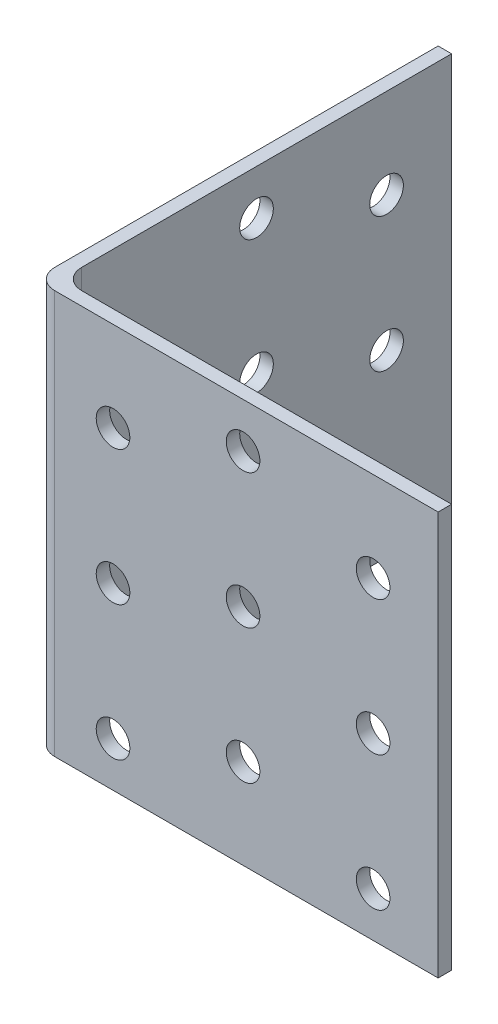
ISO-10303-21;
HEADER;
FILE_DESCRIPTION(('STEP AP214'),'2;1');
FILE_NAME('part.step','',(''),(''),'','','');
FILE_SCHEMA(('AUTOMOTIVE_DESIGN { 1 0 10303 214 1 1 1 1 }'));
ENDSEC;
DATA;
#1=APPLICATION_CONTEXT('core data for automotive mechanical design processes');
#2=APPLICATION_PROTOCOL_DEFINITION('international standard','automotive_design',2000,#1);
#3=PRODUCT_CONTEXT('',#1,'mechanical');
#4=PRODUCT('Part','Part','',(#3));
#5=PRODUCT_RELATED_PRODUCT_CATEGORY('part','',(#4));
#6=PRODUCT_DEFINITION_FORMATION('','',#4);
#7=PRODUCT_DEFINITION_CONTEXT('part definition',#1,'design');
#8=PRODUCT_DEFINITION('design','',#6,#7);
#9=PRODUCT_DEFINITION_SHAPE('','',#8);
#10=(LENGTH_UNIT() NAMED_UNIT(*) SI_UNIT(.MILLI.,.METRE.));
#11=(NAMED_UNIT(*) PLANE_ANGLE_UNIT() SI_UNIT($,.RADIAN.));
#12=(NAMED_UNIT(*) SI_UNIT($,.STERADIAN.) SOLID_ANGLE_UNIT());
#13=UNCERTAINTY_MEASURE_WITH_UNIT(LENGTH_MEASURE(1.E-05),#10,'distance_accuracy_value','');
#14=(GEOMETRIC_REPRESENTATION_CONTEXT(3) GLOBAL_UNCERTAINTY_ASSIGNED_CONTEXT((#13)) GLOBAL_UNIT_ASSIGNED_CONTEXT((#10,
#11,#12)) REPRESENTATION_CONTEXT('',''));
#15=CARTESIAN_POINT('',(0.,0.,0.));
#16=DIRECTION('',(0.,0.,1.));
#17=DIRECTION('',(1.,0.,0.));
#18=AXIS2_PLACEMENT_3D('',#15,#16,#17);
#19=CARTESIAN_POINT('',(0.,30.,-60.));
#20=DIRECTION('',(0.,0.,1.));
#21=DIRECTION('',(1.,0.,0.));
#22=AXIS2_PLACEMENT_3D('',#19,#20,#21);
#23=PLANE('',#22);
#24=DIRECTION('',(-1.,0.,0.));
#25=VECTOR('',#24,1.);
#26=CARTESIAN_POINT('',(0.,-30.,-60.));
#27=LINE('',#26,#25);
#28=CARTESIAN_POINT('',(2.,-30.,-60.));
#29=VERTEX_POINT('',#28);
#30=CARTESIAN_POINT('',(0.,-30.,-60.));
#31=VERTEX_POINT('',#30);
#32=EDGE_CURVE('E134',#29,#31,#27,.T.);
#33=ORIENTED_EDGE('',*,*,#32,.T.);
#34=DIRECTION('',(0.,-1.,0.));
#35=VECTOR('',#34,1.);
#36=CARTESIAN_POINT('',(0.,30.,-60.));
#37=LINE('',#36,#35);
#38=CARTESIAN_POINT('',(0.,30.,-60.));
#39=VERTEX_POINT('',#38);
#40=EDGE_CURVE('E11',#39,#31,#37,.T.);
#41=ORIENTED_EDGE('',*,*,#40,.F.);
#42=DIRECTION('',(-1.,0.,0.));
#43=VECTOR('',#42,1.);
#44=CARTESIAN_POINT('',(0.,30.,-60.));
#45=LINE('',#44,#43);
#46=CARTESIAN_POINT('',(2.,30.,-60.));
#47=VERTEX_POINT('',#46);
#48=EDGE_CURVE('E149',#47,#39,#45,.T.);
#49=ORIENTED_EDGE('',*,*,#48,.F.);
#50=DIRECTION('',(0.,-1.,0.));
#51=VECTOR('',#50,1.);
#52=CARTESIAN_POINT('',(2.,30.,-60.));
#53=LINE('',#52,#51);
#54=EDGE_CURVE('E130',#47,#29,#53,.T.);
#55=ORIENTED_EDGE('',*,*,#54,.T.);
#56=EDGE_LOOP('',(#33,#41,#49,#55));
#57=FACE_BOUND('',#56,.T.);
#58=ADVANCED_FACE('F38',(#57),#23,.F.);
#59=CARTESIAN_POINT('',(0.,30.,-3.00000000000002));
#60=DIRECTION('',(1.,0.,0.));
#61=DIRECTION('',(0.,0.,-1.));
#62=AXIS2_PLACEMENT_3D('',#59,#60,#61);
#63=PLANE('',#62);
#64=CARTESIAN_POINT('',(0.,-3.33333333333333,-50.3333333333333));
#65=DIRECTION('',(1.,0.,0.));
#66=DIRECTION('',(0.,0.,-1.));
#67=AXIS2_PLACEMENT_3D('',#64,#65,#66);
#68=CIRCLE('',#67,2.5);
#69=CARTESIAN_POINT('',(0.,-3.33333333333333,-52.8333333333333));
#70=VERTEX_POINT('',#69);
#71=EDGE_CURVE('E228',#70,#70,#68,.F.);
#72=ORIENTED_EDGE('',*,*,#71,.F.);
#73=EDGE_LOOP('',(#72));
#74=FACE_BOUND('',#73,.T.);
#75=CARTESIAN_POINT('',(0.,16.6666666666667,-50.3333333333333));
#76=DIRECTION('',(1.,0.,0.));
#77=DIRECTION('',(0.,0.,-1.));
#78=AXIS2_PLACEMENT_3D('',#75,#76,#77);
#79=CIRCLE('',#78,2.5);
#80=CARTESIAN_POINT('',(0.,16.6666666666667,-52.8333333333333));
#81=VERTEX_POINT('',#80);
#82=EDGE_CURVE('E238',#81,#81,#79,.F.);
#83=ORIENTED_EDGE('',*,*,#82,.F.);
#84=EDGE_LOOP('',(#83));
#85=FACE_BOUND('',#84,.T.);
#86=CARTESIAN_POINT('',(0.,3.33333333333333,-31.));
#87=DIRECTION('',(1.,0.,0.));
#88=DIRECTION('',(0.,0.,-1.));
#89=AXIS2_PLACEMENT_3D('',#86,#87,#88);
#90=CIRCLE('',#89,2.5);
#91=CARTESIAN_POINT('',(0.,3.33333333333333,-33.5));
#92=VERTEX_POINT('',#91);
#93=EDGE_CURVE('E241',#92,#92,#90,.F.);
#94=ORIENTED_EDGE('',*,*,#93,.F.);
#95=EDGE_LOOP('',(#94));
#96=FACE_BOUND('',#95,.T.);
#97=CARTESIAN_POINT('',(0.,23.3333333333333,-31.));
#98=DIRECTION('',(1.,0.,0.));
#99=DIRECTION('',(0.,0.,-1.));
#100=AXIS2_PLACEMENT_3D('',#97,#98,#99);
#101=CIRCLE('',#100,2.5);
#102=CARTESIAN_POINT('',(0.,23.3333333333333,-33.5));
#103=VERTEX_POINT('',#102);
#104=EDGE_CURVE('E244',#103,#103,#101,.F.);
#105=ORIENTED_EDGE('',*,*,#104,.F.);
#106=EDGE_LOOP('',(#105));
#107=FACE_BOUND('',#106,.T.);
#108=CARTESIAN_POINT('',(0.,-16.6666666666667,-31.));
#109=DIRECTION('',(1.,0.,0.));
#110=DIRECTION('',(0.,0.,-1.));
#111=AXIS2_PLACEMENT_3D('',#108,#109,#110);
#112=CIRCLE('',#111,2.5);
#113=CARTESIAN_POINT('',(0.,-16.6666666666667,-33.5));
#114=VERTEX_POINT('',#113);
#115=EDGE_CURVE('E247',#114,#114,#112,.F.);
#116=ORIENTED_EDGE('',*,*,#115,.F.);
#117=EDGE_LOOP('',(#116));
#118=FACE_BOUND('',#117,.T.);
#119=CARTESIAN_POINT('',(0.,-23.3333333333333,-11.6666666666667));
#120=DIRECTION('',(1.,0.,0.));
#121=DIRECTION('',(0.,0.,-1.));
#122=AXIS2_PLACEMENT_3D('',#119,#120,#121);
#123=CIRCLE('',#122,2.5);
#124=CARTESIAN_POINT('',(0.,-23.3333333333333,-14.1666666666667));
#125=VERTEX_POINT('',#124);
#126=EDGE_CURVE('E250',#125,#125,#123,.F.);
#127=ORIENTED_EDGE('',*,*,#126,.F.);
#128=EDGE_LOOP('',(#127));
#129=FACE_BOUND('',#128,.T.);
#130=CARTESIAN_POINT('',(0.,-3.33333333333333,-11.6666666666667));
#131=DIRECTION('',(1.,0.,0.));
#132=DIRECTION('',(0.,0.,-1.));
#133=AXIS2_PLACEMENT_3D('',#130,#131,#132);
#134=CIRCLE('',#133,2.5);
#135=CARTESIAN_POINT('',(0.,-3.33333333333333,-14.1666666666667));
#136=VERTEX_POINT('',#135);
#137=EDGE_CURVE('E253',#136,#136,#134,.F.);
#138=ORIENTED_EDGE('',*,*,#137,.F.);
#139=EDGE_LOOP('',(#138));
#140=FACE_BOUND('',#139,.T.);
#141=CARTESIAN_POINT('',(0.,16.6666666666667,-11.6666666666667));
#142=DIRECTION('',(1.,0.,0.));
#143=DIRECTION('',(0.,0.,-1.));
#144=AXIS2_PLACEMENT_3D('',#141,#142,#143);
#145=CIRCLE('',#144,2.5);
#146=CARTESIAN_POINT('',(0.,16.6666666666667,-14.1666666666667));
#147=VERTEX_POINT('',#146);
#148=EDGE_CURVE('E256',#147,#147,#145,.F.);
#149=ORIENTED_EDGE('',*,*,#148,.F.);
#150=EDGE_LOOP('',(#149));
#151=FACE_BOUND('',#150,.T.);
#152=CARTESIAN_POINT('',(0.,-23.3333333333333,-50.3333333333333));
#153=DIRECTION('',(1.,0.,0.));
#154=DIRECTION('',(0.,0.,-1.));
#155=AXIS2_PLACEMENT_3D('',#152,#153,#154);
#156=CIRCLE('',#155,2.5);
#157=CARTESIAN_POINT('',(0.,-23.3333333333333,-52.8333333333333));
#158=VERTEX_POINT('',#157);
#159=EDGE_CURVE('E259',#158,#158,#156,.F.);
#160=ORIENTED_EDGE('',*,*,#159,.F.);
#161=EDGE_LOOP('',(#160));
#162=FACE_BOUND('',#161,.T.);
#163=DIRECTION('',(0.,0.,1.));
#164=VECTOR('',#163,1.);
#165=CARTESIAN_POINT('',(0.,-30.,-3.00000000000002));
#166=LINE('',#165,#164);
#167=CARTESIAN_POINT('',(0.,-30.,-3.00000000000002));
#168=VERTEX_POINT('',#167);
#169=EDGE_CURVE('E137',#31,#168,#166,.T.);
#170=ORIENTED_EDGE('',*,*,#169,.T.);
#171=DIRECTION('',(0.,-1.,0.));
#172=VECTOR('',#171,1.);
#173=CARTESIAN_POINT('',(0.,30.,-3.00000000000002));
#174=LINE('',#173,#172);
#175=CARTESIAN_POINT('',(0.,30.,-3.00000000000002));
#176=VERTEX_POINT('',#175);
#177=EDGE_CURVE('E46',#176,#168,#174,.T.);
#178=ORIENTED_EDGE('',*,*,#177,.F.);
#179=DIRECTION('',(0.,0.,1.));
#180=VECTOR('',#179,1.);
#181=CARTESIAN_POINT('',(0.,30.,-3.00000000000002));
#182=LINE('',#181,#180);
#183=EDGE_CURVE('E97',#39,#176,#182,.T.);
#184=ORIENTED_EDGE('',*,*,#183,.F.);
#185=ORIENTED_EDGE('',*,*,#40,.T.);
#186=EDGE_LOOP('',(#170,#178,#184,#185));
#187=FACE_BOUND('',#186,.T.);
#188=ADVANCED_FACE('F301',(#74,#85,#96,#107,#118,#129,#140,#151,#162,#187),#63,.F.);
#189=CARTESIAN_POINT('',(3.,30.,-3.));
#190=DIRECTION('',(0.,-1.,0.));
#191=DIRECTION('',(0.,0.,-1.));
#192=AXIS2_PLACEMENT_3D('',#189,#190,#191);
#193=CYLINDRICAL_SURFACE('',#192,3.);
#194=CARTESIAN_POINT('',(3.,-30.,-3.));
#195=DIRECTION('',(0.,1.,0.));
#196=DIRECTION('',(0.,0.,1.));
#197=AXIS2_PLACEMENT_3D('',#194,#195,#196);
#198=CIRCLE('',#197,3.);
#199=CARTESIAN_POINT('',(3.,-30.,0.));
#200=VERTEX_POINT('',#199);
#201=EDGE_CURVE('E140',#168,#200,#198,.T.);
#202=ORIENTED_EDGE('',*,*,#201,.T.);
#203=DIRECTION('',(0.,-1.,0.));
#204=VECTOR('',#203,1.);
#205=CARTESIAN_POINT('',(3.,30.,0.));
#206=LINE('',#205,#204);
#207=CARTESIAN_POINT('',(3.,30.,0.));
#208=VERTEX_POINT('',#207);
#209=EDGE_CURVE('E156',#208,#200,#206,.T.);
#210=ORIENTED_EDGE('',*,*,#209,.F.);
#211=CARTESIAN_POINT('',(3.,30.,-3.));
#212=DIRECTION('',(0.,1.,0.));
#213=DIRECTION('',(0.,0.,1.));
#214=AXIS2_PLACEMENT_3D('',#211,#212,#213);
#215=CIRCLE('',#214,3.);
#216=EDGE_CURVE('E164',#176,#208,#215,.T.);
#217=ORIENTED_EDGE('',*,*,#216,.F.);
#218=ORIENTED_EDGE('',*,*,#177,.T.);
#219=EDGE_LOOP('',(#202,#210,#217,#218));
#220=FACE_BOUND('',#219,.T.);
#221=ADVANCED_FACE('F162',(#220),#193,.T.);
#222=CARTESIAN_POINT('',(60.,30.,0.));
#223=DIRECTION('',(0.,0.,-1.));
#224=DIRECTION('',(-1.,0.,0.));
#225=AXIS2_PLACEMENT_3D('',#222,#223,#224);
#226=PLANE('',#225);
#227=CARTESIAN_POINT('',(50.3333333333333,-3.33333333333333,0.));
#228=DIRECTION('',(0.,0.,-1.));
#229=DIRECTION('',(-1.,0.,0.));
#230=AXIS2_PLACEMENT_3D('',#227,#228,#229);
#231=CIRCLE('',#230,2.5);
#232=CARTESIAN_POINT('',(47.8333333333333,-3.33333333333333,0.));
#233=VERTEX_POINT('',#232);
#234=EDGE_CURVE('E138',#233,#233,#231,.T.);
#235=ORIENTED_EDGE('',*,*,#234,.T.);
#236=EDGE_LOOP('',(#235));
#237=FACE_BOUND('',#236,.T.);
#238=CARTESIAN_POINT('',(50.3333333333333,16.6666666666667,0.));
#239=DIRECTION('',(0.,0.,-1.));
#240=DIRECTION('',(-1.,0.,0.));
#241=AXIS2_PLACEMENT_3D('',#238,#239,#240);
#242=CIRCLE('',#241,2.5);
#243=CARTESIAN_POINT('',(47.8333333333333,16.6666666666667,0.));
#244=VERTEX_POINT('',#243);
#245=EDGE_CURVE('E184',#244,#244,#242,.T.);
#246=ORIENTED_EDGE('',*,*,#245,.T.);
#247=EDGE_LOOP('',(#246));
#248=FACE_BOUND('',#247,.T.);
#249=CARTESIAN_POINT('',(31.,3.33333333333333,0.));
#250=DIRECTION('',(0.,0.,-1.));
#251=DIRECTION('',(-1.,0.,0.));
#252=AXIS2_PLACEMENT_3D('',#249,#250,#251);
#253=CIRCLE('',#252,2.5);
#254=CARTESIAN_POINT('',(28.5,3.33333333333333,0.));
#255=VERTEX_POINT('',#254);
#256=EDGE_CURVE('E187',#255,#255,#253,.T.);
#257=ORIENTED_EDGE('',*,*,#256,.T.);
#258=EDGE_LOOP('',(#257));
#259=FACE_BOUND('',#258,.T.);
#260=CARTESIAN_POINT('',(31.,23.3333333333333,0.));
#261=DIRECTION('',(0.,0.,-1.));
#262=DIRECTION('',(-1.,0.,0.));
#263=AXIS2_PLACEMENT_3D('',#260,#261,#262);
#264=CIRCLE('',#263,2.5);
#265=CARTESIAN_POINT('',(28.5,23.3333333333333,0.));
#266=VERTEX_POINT('',#265);
#267=EDGE_CURVE('E190',#266,#266,#264,.T.);
#268=ORIENTED_EDGE('',*,*,#267,.T.);
#269=EDGE_LOOP('',(#268));
#270=FACE_BOUND('',#269,.T.);
#271=CARTESIAN_POINT('',(31.,-16.6666666666667,0.));
#272=DIRECTION('',(0.,0.,-1.));
#273=DIRECTION('',(-1.,0.,0.));
#274=AXIS2_PLACEMENT_3D('',#271,#272,#273);
#275=CIRCLE('',#274,2.5);
#276=CARTESIAN_POINT('',(28.5,-16.6666666666667,0.));
#277=VERTEX_POINT('',#276);
#278=EDGE_CURVE('E193',#277,#277,#275,.T.);
#279=ORIENTED_EDGE('',*,*,#278,.T.);
#280=EDGE_LOOP('',(#279));
#281=FACE_BOUND('',#280,.T.);
#282=CARTESIAN_POINT('',(11.6666666666667,-23.3333333333333,0.));
#283=DIRECTION('',(0.,0.,-1.));
#284=DIRECTION('',(-1.,0.,0.));
#285=AXIS2_PLACEMENT_3D('',#282,#283,#284);
#286=CIRCLE('',#285,2.5);
#287=CARTESIAN_POINT('',(9.16666666666666,-23.3333333333333,0.));
#288=VERTEX_POINT('',#287);
#289=EDGE_CURVE('E196',#288,#288,#286,.T.);
#290=ORIENTED_EDGE('',*,*,#289,.T.);
#291=EDGE_LOOP('',(#290));
#292=FACE_BOUND('',#291,.T.);
#293=CARTESIAN_POINT('',(11.6666666666667,-3.33333333333333,0.));
#294=DIRECTION('',(0.,0.,-1.));
#295=DIRECTION('',(-1.,0.,0.));
#296=AXIS2_PLACEMENT_3D('',#293,#294,#295);
#297=CIRCLE('',#296,2.5);
#298=CARTESIAN_POINT('',(9.16666666666666,-3.33333333333333,0.));
#299=VERTEX_POINT('',#298);
#300=EDGE_CURVE('E199',#299,#299,#297,.T.);
#301=ORIENTED_EDGE('',*,*,#300,.T.);
#302=EDGE_LOOP('',(#301));
#303=FACE_BOUND('',#302,.T.);
#304=CARTESIAN_POINT('',(11.6666666666667,16.6666666666667,0.));
#305=DIRECTION('',(0.,0.,-1.));
#306=DIRECTION('',(-1.,0.,0.));
#307=AXIS2_PLACEMENT_3D('',#304,#305,#306);
#308=CIRCLE('',#307,2.5);
#309=CARTESIAN_POINT('',(9.16666666666666,16.6666666666667,0.));
#310=VERTEX_POINT('',#309);
#311=EDGE_CURVE('E202',#310,#310,#308,.T.);
#312=ORIENTED_EDGE('',*,*,#311,.T.);
#313=EDGE_LOOP('',(#312));
#314=FACE_BOUND('',#313,.T.);
#315=CARTESIAN_POINT('',(50.3333333333333,-23.3333333333333,0.));
#316=DIRECTION('',(0.,0.,-1.));
#317=DIRECTION('',(-1.,0.,0.));
#318=AXIS2_PLACEMENT_3D('',#315,#316,#317);
#319=CIRCLE('',#318,2.5);
#320=CARTESIAN_POINT('',(47.8333333333333,-23.3333333333333,0.));
#321=VERTEX_POINT('',#320);
#322=EDGE_CURVE('E205',#321,#321,#319,.T.);
#323=ORIENTED_EDGE('',*,*,#322,.T.);
#324=EDGE_LOOP('',(#323));
#325=FACE_BOUND('',#324,.T.);
#326=DIRECTION('',(1.,0.,0.));
#327=VECTOR('',#326,1.);
#328=CARTESIAN_POINT('',(60.,-30.,0.));
#329=LINE('',#328,#327);
#330=CARTESIAN_POINT('',(60.,-30.,0.));
#331=VERTEX_POINT('',#330);
#332=EDGE_CURVE('E142',#200,#331,#329,.T.);
#333=ORIENTED_EDGE('',*,*,#332,.T.);
#334=DIRECTION('',(0.,-1.,0.));
#335=VECTOR('',#334,1.);
#336=CARTESIAN_POINT('',(60.,30.,0.));
#337=LINE('',#336,#335);
#338=CARTESIAN_POINT('',(60.,30.,0.));
#339=VERTEX_POINT('',#338);
#340=EDGE_CURVE('E153',#339,#331,#337,.T.);
#341=ORIENTED_EDGE('',*,*,#340,.F.);
#342=DIRECTION('',(1.,0.,0.));
#343=VECTOR('',#342,1.);
#344=CARTESIAN_POINT('',(60.,30.,0.));
#345=LINE('',#344,#343);
#346=EDGE_CURVE('E176',#208,#339,#345,.T.);
#347=ORIENTED_EDGE('',*,*,#346,.F.);
#348=ORIENTED_EDGE('',*,*,#209,.T.);
#349=EDGE_LOOP('',(#333,#341,#347,#348));
#350=FACE_BOUND('',#349,.T.);
#351=ADVANCED_FACE('F172',(#237,#248,#259,#270,#281,#292,#303,#314,#325,#350),#226,.F.);
#352=CARTESIAN_POINT('',(60.,30.,-2.));
#353=DIRECTION('',(-1.,0.,0.));
#354=DIRECTION('',(0.,0.,1.));
#355=AXIS2_PLACEMENT_3D('',#352,#353,#354);
#356=PLANE('',#355);
#357=DIRECTION('',(0.,0.,-1.));
#358=VECTOR('',#357,1.);
#359=CARTESIAN_POINT('',(60.,-30.,-2.));
#360=LINE('',#359,#358);
#361=CARTESIAN_POINT('',(60.,-30.,-2.));
#362=VERTEX_POINT('',#361);
#363=EDGE_CURVE('E144',#331,#362,#360,.T.);
#364=ORIENTED_EDGE('',*,*,#363,.T.);
#365=DIRECTION('',(0.,-1.,0.));
#366=VECTOR('',#365,1.);
#367=CARTESIAN_POINT('',(60.,30.,-2.));
#368=LINE('',#367,#366);
#369=CARTESIAN_POINT('',(60.,30.,-2.));
#370=VERTEX_POINT('',#369);
#371=EDGE_CURVE('E125',#370,#362,#368,.T.);
#372=ORIENTED_EDGE('',*,*,#371,.F.);
#373=DIRECTION('',(0.,0.,-1.));
#374=VECTOR('',#373,1.);
#375=CARTESIAN_POINT('',(60.,30.,-2.));
#376=LINE('',#375,#374);
#377=EDGE_CURVE('E116',#339,#370,#376,.T.);
#378=ORIENTED_EDGE('',*,*,#377,.F.);
#379=ORIENTED_EDGE('',*,*,#340,.T.);
#380=EDGE_LOOP('',(#364,#372,#378,#379));
#381=FACE_BOUND('',#380,.T.);
#382=ADVANCED_FACE('F175',(#381),#356,.F.);
#383=CARTESIAN_POINT('',(5.00000000000003,30.,-2.));
#384=DIRECTION('',(0.,0.,1.));
#385=DIRECTION('',(1.,0.,0.));
#386=AXIS2_PLACEMENT_3D('',#383,#384,#385);
#387=PLANE('',#386);
#388=CARTESIAN_POINT('',(50.3333333333333,-3.33333333333333,-2.));
#389=DIRECTION('',(0.,0.,-1.));
#390=DIRECTION('',(-1.,0.,0.));
#391=AXIS2_PLACEMENT_3D('',#388,#389,#390);
#392=CIRCLE('',#391,2.5);
#393=CARTESIAN_POINT('',(47.8333333333333,-3.33333333333333,-2.));
#394=VERTEX_POINT('',#393);
#395=EDGE_CURVE('E211',#394,#394,#392,.T.);
#396=ORIENTED_EDGE('',*,*,#395,.F.);
#397=EDGE_LOOP('',(#396));
#398=FACE_BOUND('',#397,.T.);
#399=CARTESIAN_POINT('',(50.3333333333333,16.6666666666667,-2.));
#400=DIRECTION('',(0.,0.,-1.));
#401=DIRECTION('',(-1.,0.,0.));
#402=AXIS2_PLACEMENT_3D('',#399,#400,#401);
#403=CIRCLE('',#402,2.5);
#404=CARTESIAN_POINT('',(47.8333333333333,16.6666666666667,-2.));
#405=VERTEX_POINT('',#404);
#406=EDGE_CURVE('E219',#405,#405,#403,.T.);
#407=ORIENTED_EDGE('',*,*,#406,.F.);
#408=EDGE_LOOP('',(#407));
#409=FACE_BOUND('',#408,.T.);
#410=CARTESIAN_POINT('',(31.,3.33333333333333,-2.));
#411=DIRECTION('',(0.,0.,-1.));
#412=DIRECTION('',(-1.,0.,0.));
#413=AXIS2_PLACEMENT_3D('',#410,#411,#412);
#414=CIRCLE('',#413,2.5);
#415=CARTESIAN_POINT('',(28.5,3.33333333333333,-2.));
#416=VERTEX_POINT('',#415);
#417=EDGE_CURVE('E215',#416,#416,#414,.T.);
#418=ORIENTED_EDGE('',*,*,#417,.F.);
#419=EDGE_LOOP('',(#418));
#420=FACE_BOUND('',#419,.T.);
#421=CARTESIAN_POINT('',(31.,23.3333333333333,-2.));
#422=DIRECTION('',(0.,0.,-1.));
#423=DIRECTION('',(-1.,0.,0.));
#424=AXIS2_PLACEMENT_3D('',#421,#422,#423);
#425=CIRCLE('',#424,2.5);
#426=CARTESIAN_POINT('',(28.5,23.3333333333333,-2.));
#427=VERTEX_POINT('',#426);
#428=EDGE_CURVE('E212',#427,#427,#425,.T.);
#429=ORIENTED_EDGE('',*,*,#428,.F.);
#430=EDGE_LOOP('',(#429));
#431=FACE_BOUND('',#430,.T.);
#432=CARTESIAN_POINT('',(31.,-16.6666666666667,-2.));
#433=DIRECTION('',(0.,0.,-1.));
#434=DIRECTION('',(-1.,0.,0.));
#435=AXIS2_PLACEMENT_3D('',#432,#433,#434);
#436=CIRCLE('',#435,2.5);
#437=CARTESIAN_POINT('',(28.5,-16.6666666666667,-2.));
#438=VERTEX_POINT('',#437);
#439=EDGE_CURVE('E216',#438,#438,#436,.T.);
#440=ORIENTED_EDGE('',*,*,#439,.F.);
#441=EDGE_LOOP('',(#440));
#442=FACE_BOUND('',#441,.T.);
#443=CARTESIAN_POINT('',(11.6666666666667,-23.3333333333333,-2.));
#444=DIRECTION('',(0.,0.,-1.));
#445=DIRECTION('',(-1.,0.,0.));
#446=AXIS2_PLACEMENT_3D('',#443,#444,#445);
#447=CIRCLE('',#446,2.5);
#448=CARTESIAN_POINT('',(9.16666666666666,-23.3333333333333,-2.));
#449=VERTEX_POINT('',#448);
#450=EDGE_CURVE('E231',#449,#449,#447,.T.);
#451=ORIENTED_EDGE('',*,*,#450,.F.);
#452=EDGE_LOOP('',(#451));
#453=FACE_BOUND('',#452,.T.);
#454=CARTESIAN_POINT('',(11.6666666666667,-3.33333333333333,-2.));
#455=DIRECTION('',(0.,0.,-1.));
#456=DIRECTION('',(-1.,0.,0.));
#457=AXIS2_PLACEMENT_3D('',#454,#455,#456);
#458=CIRCLE('',#457,2.5);
#459=CARTESIAN_POINT('',(9.16666666666666,-3.33333333333333,-2.));
#460=VERTEX_POINT('',#459);
#461=EDGE_CURVE('E227',#460,#460,#458,.T.);
#462=ORIENTED_EDGE('',*,*,#461,.F.);
#463=EDGE_LOOP('',(#462));
#464=FACE_BOUND('',#463,.T.);
#465=CARTESIAN_POINT('',(11.6666666666667,16.6666666666667,-2.));
#466=DIRECTION('',(0.,0.,-1.));
#467=DIRECTION('',(-1.,0.,0.));
#468=AXIS2_PLACEMENT_3D('',#465,#466,#467);
#469=CIRCLE('',#468,2.5);
#470=CARTESIAN_POINT('',(9.16666666666666,16.6666666666667,-2.));
#471=VERTEX_POINT('',#470);
#472=EDGE_CURVE('E224',#471,#471,#469,.T.);
#473=ORIENTED_EDGE('',*,*,#472,.F.);
#474=EDGE_LOOP('',(#473));
#475=FACE_BOUND('',#474,.T.);
#476=CARTESIAN_POINT('',(50.3333333333333,-23.3333333333333,-2.));
#477=DIRECTION('',(0.,0.,-1.));
#478=DIRECTION('',(-1.,0.,0.));
#479=AXIS2_PLACEMENT_3D('',#476,#477,#478);
#480=CIRCLE('',#479,2.5);
#481=CARTESIAN_POINT('',(47.8333333333333,-23.3333333333333,-2.));
#482=VERTEX_POINT('',#481);
#483=EDGE_CURVE('E208',#482,#482,#480,.T.);
#484=ORIENTED_EDGE('',*,*,#483,.F.);
#485=EDGE_LOOP('',(#484));
#486=FACE_BOUND('',#485,.T.);
#487=DIRECTION('',(-1.,0.,0.));
#488=VECTOR('',#487,1.);
#489=CARTESIAN_POINT('',(5.00000000000003,-30.,-2.));
#490=LINE('',#489,#488);
#491=CARTESIAN_POINT('',(5.00000000000003,-30.,-2.));
#492=VERTEX_POINT('',#491);
#493=EDGE_CURVE('E124',#362,#492,#490,.T.);
#494=ORIENTED_EDGE('',*,*,#493,.T.);
#495=DIRECTION('',(0.,-1.,0.));
#496=VECTOR('',#495,1.);
#497=CARTESIAN_POINT('',(5.00000000000003,30.,-2.));
#498=LINE('',#497,#496);
#499=CARTESIAN_POINT('',(5.00000000000003,30.,-2.));
#500=VERTEX_POINT('',#499);
#501=EDGE_CURVE('E121',#500,#492,#498,.T.);
#502=ORIENTED_EDGE('',*,*,#501,.F.);
#503=DIRECTION('',(-1.,0.,0.));
#504=VECTOR('',#503,1.);
#505=CARTESIAN_POINT('',(5.00000000000003,30.,-2.));
#506=LINE('',#505,#504);
#507=EDGE_CURVE('E110',#370,#500,#506,.T.);
#508=ORIENTED_EDGE('',*,*,#507,.F.);
#509=ORIENTED_EDGE('',*,*,#371,.T.);
#510=EDGE_LOOP('',(#494,#502,#508,#509));
#511=FACE_BOUND('',#510,.T.);
#512=ADVANCED_FACE('F122',(#398,#409,#420,#431,#442,#453,#464,#475,#486,#511),#387,.F.);
#513=CARTESIAN_POINT('',(5.00000000000001,30.,-5.));
#514=DIRECTION('',(0.,-1.,0.));
#515=DIRECTION('',(0.,0.,-1.));
#516=AXIS2_PLACEMENT_3D('',#513,#514,#515);
#517=CYLINDRICAL_SURFACE('',#516,3.);
#518=CARTESIAN_POINT('',(5.00000000000001,-30.,-5.));
#519=DIRECTION('',(0.,-1.,0.));
#520=DIRECTION('',(0.,0.,1.));
#521=AXIS2_PLACEMENT_3D('',#518,#519,#520);
#522=CIRCLE('',#521,3.);
#523=CARTESIAN_POINT('',(2.00000000000001,-30.,-5.00000000000002));
#524=VERTEX_POINT('',#523);
#525=EDGE_CURVE('E83',#492,#524,#522,.T.);
#526=ORIENTED_EDGE('',*,*,#525,.T.);
#527=DIRECTION('',(0.,-1.,0.));
#528=VECTOR('',#527,1.);
#529=CARTESIAN_POINT('',(2.00000000000001,30.,-5.00000000000002));
#530=LINE('',#529,#528);
#531=CARTESIAN_POINT('',(2.00000000000001,30.,-5.00000000000002));
#532=VERTEX_POINT('',#531);
#533=EDGE_CURVE('E126',#532,#524,#530,.T.);
#534=ORIENTED_EDGE('',*,*,#533,.F.);
#535=CARTESIAN_POINT('',(5.00000000000001,30.,-5.));
#536=DIRECTION('',(0.,-1.,0.));
#537=DIRECTION('',(0.,0.,1.));
#538=AXIS2_PLACEMENT_3D('',#535,#536,#537);
#539=CIRCLE('',#538,3.);
#540=EDGE_CURVE('E114',#500,#532,#539,.T.);
#541=ORIENTED_EDGE('',*,*,#540,.F.);
#542=ORIENTED_EDGE('',*,*,#501,.T.);
#543=EDGE_LOOP('',(#526,#534,#541,#542));
#544=FACE_BOUND('',#543,.T.);
#545=ADVANCED_FACE('F128',(#544),#517,.F.);
#546=CARTESIAN_POINT('',(2.,30.,-60.));
#547=DIRECTION('',(-1.,0.,0.));
#548=DIRECTION('',(0.,0.,1.));
#549=AXIS2_PLACEMENT_3D('',#546,#547,#548);
#550=PLANE('',#549);
#551=CARTESIAN_POINT('',(2.00000000000015,-3.33333333333333,-50.3333333333333));
#552=DIRECTION('',(-1.,0.,0.));
#553=DIRECTION('',(0.,0.,1.));
#554=AXIS2_PLACEMENT_3D('',#551,#552,#553);
#555=CIRCLE('',#554,2.5);
#556=CARTESIAN_POINT('',(2.00000000000014,-3.33333333333333,-47.8333333333333));
#557=VERTEX_POINT('',#556);
#558=EDGE_CURVE('E265',#557,#557,#555,.T.);
#559=ORIENTED_EDGE('',*,*,#558,.T.);
#560=EDGE_LOOP('',(#559));
#561=FACE_BOUND('',#560,.T.);
#562=CARTESIAN_POINT('',(2.00000000000015,16.6666666666667,-50.3333333333333));
#563=DIRECTION('',(-1.,0.,0.));
#564=DIRECTION('',(0.,0.,1.));
#565=AXIS2_PLACEMENT_3D('',#562,#563,#564);
#566=CIRCLE('',#565,2.5);
#567=CARTESIAN_POINT('',(2.00000000000014,16.6666666666667,-47.8333333333333));
#568=VERTEX_POINT('',#567);
#569=EDGE_CURVE('E273',#568,#568,#566,.T.);
#570=ORIENTED_EDGE('',*,*,#569,.T.);
#571=EDGE_LOOP('',(#570));
#572=FACE_BOUND('',#571,.T.);
#573=CARTESIAN_POINT('',(2.00000000000009,3.33333333333333,-31.));
#574=DIRECTION('',(-1.,0.,0.));
#575=DIRECTION('',(0.,0.,1.));
#576=AXIS2_PLACEMENT_3D('',#573,#574,#575);
#577=CIRCLE('',#576,2.5);
#578=CARTESIAN_POINT('',(2.00000000000009,3.33333333333333,-28.5));
#579=VERTEX_POINT('',#578);
#580=EDGE_CURVE('E269',#579,#579,#577,.T.);
#581=ORIENTED_EDGE('',*,*,#580,.T.);
#582=EDGE_LOOP('',(#581));
#583=FACE_BOUND('',#582,.T.);
#584=CARTESIAN_POINT('',(2.00000000000009,23.3333333333333,-31.));
#585=DIRECTION('',(-1.,0.,0.));
#586=DIRECTION('',(0.,0.,1.));
#587=AXIS2_PLACEMENT_3D('',#584,#585,#586);
#588=CIRCLE('',#587,2.5);
#589=CARTESIAN_POINT('',(2.00000000000009,23.3333333333333,-28.5));
#590=VERTEX_POINT('',#589);
#591=EDGE_CURVE('E266',#590,#590,#588,.T.);
#592=ORIENTED_EDGE('',*,*,#591,.T.);
#593=EDGE_LOOP('',(#592));
#594=FACE_BOUND('',#593,.T.);
#595=CARTESIAN_POINT('',(2.00000000000009,-16.6666666666667,-31.));
#596=DIRECTION('',(-1.,0.,0.));
#597=DIRECTION('',(0.,0.,1.));
#598=AXIS2_PLACEMENT_3D('',#595,#596,#597);
#599=CIRCLE('',#598,2.5);
#600=CARTESIAN_POINT('',(2.00000000000009,-16.6666666666667,-28.5));
#601=VERTEX_POINT('',#600);
#602=EDGE_CURVE('E270',#601,#601,#599,.T.);
#603=ORIENTED_EDGE('',*,*,#602,.T.);
#604=EDGE_LOOP('',(#603));
#605=FACE_BOUND('',#604,.T.);
#606=CARTESIAN_POINT('',(2.00000000000004,-23.3333333333333,-11.6666666666667));
#607=DIRECTION('',(-1.,0.,0.));
#608=DIRECTION('',(0.,0.,1.));
#609=AXIS2_PLACEMENT_3D('',#606,#607,#608);
#610=CIRCLE('',#609,2.5);
#611=CARTESIAN_POINT('',(2.00000000000003,-23.3333333333333,-9.16666666666666));
#612=VERTEX_POINT('',#611);
#613=EDGE_CURVE('E284',#612,#612,#610,.T.);
#614=ORIENTED_EDGE('',*,*,#613,.T.);
#615=EDGE_LOOP('',(#614));
#616=FACE_BOUND('',#615,.T.);
#617=CARTESIAN_POINT('',(2.00000000000004,-3.33333333333333,-11.6666666666667));
#618=DIRECTION('',(-1.,0.,0.));
#619=DIRECTION('',(0.,0.,1.));
#620=AXIS2_PLACEMENT_3D('',#617,#618,#619);
#621=CIRCLE('',#620,2.5);
#622=CARTESIAN_POINT('',(2.00000000000003,-3.33333333333333,-9.16666666666666));
#623=VERTEX_POINT('',#622);
#624=EDGE_CURVE('E281',#623,#623,#621,.T.);
#625=ORIENTED_EDGE('',*,*,#624,.T.);
#626=EDGE_LOOP('',(#625));
#627=FACE_BOUND('',#626,.T.);
#628=CARTESIAN_POINT('',(2.00000000000004,16.6666666666667,-11.6666666666667));
#629=DIRECTION('',(-1.,0.,0.));
#630=DIRECTION('',(0.,0.,1.));
#631=AXIS2_PLACEMENT_3D('',#628,#629,#630);
#632=CIRCLE('',#631,2.5);
#633=CARTESIAN_POINT('',(2.00000000000003,16.6666666666667,-9.16666666666666));
#634=VERTEX_POINT('',#633);
#635=EDGE_CURVE('E278',#634,#634,#632,.T.);
#636=ORIENTED_EDGE('',*,*,#635,.T.);
#637=EDGE_LOOP('',(#636));
#638=FACE_BOUND('',#637,.T.);
#639=CARTESIAN_POINT('',(2.00000000000015,-23.3333333333333,-50.3333333333333));
#640=DIRECTION('',(-1.,0.,0.));
#641=DIRECTION('',(0.,0.,1.));
#642=AXIS2_PLACEMENT_3D('',#639,#640,#641);
#643=CIRCLE('',#642,2.5);
#644=CARTESIAN_POINT('',(2.00000000000014,-23.3333333333333,-47.8333333333333));
#645=VERTEX_POINT('',#644);
#646=EDGE_CURVE('E262',#645,#645,#643,.T.);
#647=ORIENTED_EDGE('',*,*,#646,.T.);
#648=EDGE_LOOP('',(#647));
#649=FACE_BOUND('',#648,.T.);
#650=DIRECTION('',(0.,0.,-1.));
#651=VECTOR('',#650,1.);
#652=CARTESIAN_POINT('',(2.,-30.,-60.));
#653=LINE('',#652,#651);
#654=EDGE_CURVE('E89',#524,#29,#653,.T.);
#655=ORIENTED_EDGE('',*,*,#654,.T.);
#656=ORIENTED_EDGE('',*,*,#54,.F.);
#657=DIRECTION('',(0.,0.,-1.));
#658=VECTOR('',#657,1.);
#659=CARTESIAN_POINT('',(2.,30.,-60.));
#660=LINE('',#659,#658);
#661=EDGE_CURVE('E54',#532,#47,#660,.T.);
#662=ORIENTED_EDGE('',*,*,#661,.F.);
#663=ORIENTED_EDGE('',*,*,#533,.T.);
#664=EDGE_LOOP('',(#655,#656,#662,#663));
#665=FACE_BOUND('',#664,.T.);
#666=ADVANCED_FACE('F290',(#561,#572,#583,#594,#605,#616,#627,#638,#649,#665),#550,.F.);
#667=CARTESIAN_POINT('',(5.00000000000001,30.,-5.));
#668=DIRECTION('',(0.,1.,0.));
#669=DIRECTION('',(0.,0.,1.));
#670=AXIS2_PLACEMENT_3D('',#667,#668,#669);
#671=PLANE('',#670);
#672=ORIENTED_EDGE('',*,*,#48,.T.);
#673=ORIENTED_EDGE('',*,*,#183,.T.);
#674=ORIENTED_EDGE('',*,*,#216,.T.);
#675=ORIENTED_EDGE('',*,*,#346,.T.);
#676=ORIENTED_EDGE('',*,*,#377,.T.);
#677=ORIENTED_EDGE('',*,*,#507,.T.);
#678=ORIENTED_EDGE('',*,*,#540,.T.);
#679=ORIENTED_EDGE('',*,*,#661,.T.);
#680=EDGE_LOOP('',(#672,#673,#674,#675,#676,#677,#678,#679));
#681=FACE_BOUND('',#680,.T.);
#682=ADVANCED_FACE('F112',(#681),#671,.T.);
#683=CARTESIAN_POINT('',(5.00000000000001,-30.,-5.));
#684=DIRECTION('',(0.,1.,0.));
#685=DIRECTION('',(0.,0.,1.));
#686=AXIS2_PLACEMENT_3D('',#683,#684,#685);
#687=PLANE('',#686);
#688=ORIENTED_EDGE('',*,*,#32,.F.);
#689=ORIENTED_EDGE('',*,*,#654,.F.);
#690=ORIENTED_EDGE('',*,*,#525,.F.);
#691=ORIENTED_EDGE('',*,*,#493,.F.);
#692=ORIENTED_EDGE('',*,*,#363,.F.);
#693=ORIENTED_EDGE('',*,*,#332,.F.);
#694=ORIENTED_EDGE('',*,*,#201,.F.);
#695=ORIENTED_EDGE('',*,*,#169,.F.);
#696=EDGE_LOOP('',(#688,#689,#690,#691,#692,#693,#694,#695));
#697=FACE_BOUND('',#696,.T.);
#698=ADVANCED_FACE('F168',(#697),#687,.F.);
#699=CARTESIAN_POINT('',(50.3333333333333,-23.3333333333333,8.));
#700=DIRECTION('',(0.,0.,-1.));
#701=DIRECTION('',(-1.,0.,0.));
#702=AXIS2_PLACEMENT_3D('',#699,#700,#701);
#703=CYLINDRICAL_SURFACE('',#702,2.5);
#704=ORIENTED_EDGE('',*,*,#483,.T.);
#705=EDGE_LOOP('',(#704));
#706=FACE_BOUND('',#705,.T.);
#707=ORIENTED_EDGE('',*,*,#322,.F.);
#708=EDGE_LOOP('',(#707));
#709=FACE_BOUND('',#708,.T.);
#710=ADVANCED_FACE('F382',(#706,#709),#703,.F.);
#711=CARTESIAN_POINT('',(11.6666666666667,16.6666666666667,8.));
#712=DIRECTION('',(0.,0.,-1.));
#713=DIRECTION('',(-1.,0.,0.));
#714=AXIS2_PLACEMENT_3D('',#711,#712,#713);
#715=CYLINDRICAL_SURFACE('',#714,2.5);
#716=ORIENTED_EDGE('',*,*,#472,.T.);
#717=EDGE_LOOP('',(#716));
#718=FACE_BOUND('',#717,.T.);
#719=ORIENTED_EDGE('',*,*,#311,.F.);
#720=EDGE_LOOP('',(#719));
#721=FACE_BOUND('',#720,.T.);
#722=ADVANCED_FACE('F391',(#718,#721),#715,.F.);
#723=CARTESIAN_POINT('',(11.6666666666667,-3.33333333333333,8.));
#724=DIRECTION('',(0.,0.,-1.));
#725=DIRECTION('',(-1.,0.,0.));
#726=AXIS2_PLACEMENT_3D('',#723,#724,#725);
#727=CYLINDRICAL_SURFACE('',#726,2.5);
#728=ORIENTED_EDGE('',*,*,#461,.T.);
#729=EDGE_LOOP('',(#728));
#730=FACE_BOUND('',#729,.T.);
#731=ORIENTED_EDGE('',*,*,#300,.F.);
#732=EDGE_LOOP('',(#731));
#733=FACE_BOUND('',#732,.T.);
#734=ADVANCED_FACE('F398',(#730,#733),#727,.F.);
#735=CARTESIAN_POINT('',(11.6666666666667,-23.3333333333333,8.));
#736=DIRECTION('',(0.,0.,-1.));
#737=DIRECTION('',(-1.,0.,0.));
#738=AXIS2_PLACEMENT_3D('',#735,#736,#737);
#739=CYLINDRICAL_SURFACE('',#738,2.5);
#740=ORIENTED_EDGE('',*,*,#450,.T.);
#741=EDGE_LOOP('',(#740));
#742=FACE_BOUND('',#741,.T.);
#743=ORIENTED_EDGE('',*,*,#289,.F.);
#744=EDGE_LOOP('',(#743));
#745=FACE_BOUND('',#744,.T.);
#746=ADVANCED_FACE('F406',(#742,#745),#739,.F.);
#747=CARTESIAN_POINT('',(31.,-16.6666666666667,8.));
#748=DIRECTION('',(0.,0.,-1.));
#749=DIRECTION('',(-1.,0.,0.));
#750=AXIS2_PLACEMENT_3D('',#747,#748,#749);
#751=CYLINDRICAL_SURFACE('',#750,2.5);
#752=ORIENTED_EDGE('',*,*,#439,.T.);
#753=EDGE_LOOP('',(#752));
#754=FACE_BOUND('',#753,.T.);
#755=ORIENTED_EDGE('',*,*,#278,.F.);
#756=EDGE_LOOP('',(#755));
#757=FACE_BOUND('',#756,.T.);
#758=ADVANCED_FACE('F414',(#754,#757),#751,.F.);
#759=CARTESIAN_POINT('',(31.,23.3333333333333,8.));
#760=DIRECTION('',(0.,0.,-1.));
#761=DIRECTION('',(-1.,0.,0.));
#762=AXIS2_PLACEMENT_3D('',#759,#760,#761);
#763=CYLINDRICAL_SURFACE('',#762,2.5);
#764=ORIENTED_EDGE('',*,*,#428,.T.);
#765=EDGE_LOOP('',(#764));
#766=FACE_BOUND('',#765,.T.);
#767=ORIENTED_EDGE('',*,*,#267,.F.);
#768=EDGE_LOOP('',(#767));
#769=FACE_BOUND('',#768,.T.);
#770=ADVANCED_FACE('F422',(#766,#769),#763,.F.);
#771=CARTESIAN_POINT('',(31.,3.33333333333333,8.));
#772=DIRECTION('',(0.,0.,-1.));
#773=DIRECTION('',(-1.,0.,0.));
#774=AXIS2_PLACEMENT_3D('',#771,#772,#773);
#775=CYLINDRICAL_SURFACE('',#774,2.5);
#776=ORIENTED_EDGE('',*,*,#417,.T.);
#777=EDGE_LOOP('',(#776));
#778=FACE_BOUND('',#777,.T.);
#779=ORIENTED_EDGE('',*,*,#256,.F.);
#780=EDGE_LOOP('',(#779));
#781=FACE_BOUND('',#780,.T.);
#782=ADVANCED_FACE('F430',(#778,#781),#775,.F.);
#783=CARTESIAN_POINT('',(50.3333333333333,16.6666666666667,8.));
#784=DIRECTION('',(0.,0.,-1.));
#785=DIRECTION('',(-1.,0.,0.));
#786=AXIS2_PLACEMENT_3D('',#783,#784,#785);
#787=CYLINDRICAL_SURFACE('',#786,2.5);
#788=ORIENTED_EDGE('',*,*,#406,.T.);
#789=EDGE_LOOP('',(#788));
#790=FACE_BOUND('',#789,.T.);
#791=ORIENTED_EDGE('',*,*,#245,.F.);
#792=EDGE_LOOP('',(#791));
#793=FACE_BOUND('',#792,.T.);
#794=ADVANCED_FACE('F438',(#790,#793),#787,.F.);
#795=CARTESIAN_POINT('',(50.3333333333333,-3.33333333333333,8.));
#796=DIRECTION('',(0.,0.,-1.));
#797=DIRECTION('',(-1.,0.,0.));
#798=AXIS2_PLACEMENT_3D('',#795,#796,#797);
#799=CYLINDRICAL_SURFACE('',#798,2.5);
#800=ORIENTED_EDGE('',*,*,#395,.T.);
#801=EDGE_LOOP('',(#800));
#802=FACE_BOUND('',#801,.T.);
#803=ORIENTED_EDGE('',*,*,#234,.F.);
#804=EDGE_LOOP('',(#803));
#805=FACE_BOUND('',#804,.T.);
#806=ADVANCED_FACE('F446',(#802,#805),#799,.F.);
#807=CARTESIAN_POINT('',(-7.99999999999985,-23.3333333333333,-50.3333333333334));
#808=DIRECTION('',(1.,0.,0.));
#809=DIRECTION('',(0.,0.,-1.));
#810=AXIS2_PLACEMENT_3D('',#807,#808,#809);
#811=CYLINDRICAL_SURFACE('',#810,2.5);
#812=ORIENTED_EDGE('',*,*,#646,.F.);
#813=EDGE_LOOP('',(#812));
#814=FACE_BOUND('',#813,.T.);
#815=ORIENTED_EDGE('',*,*,#159,.T.);
#816=EDGE_LOOP('',(#815));
#817=FACE_BOUND('',#816,.T.);
#818=ADVANCED_FACE('F453',(#814,#817),#811,.F.);
#819=CARTESIAN_POINT('',(-7.99999999999997,16.6666666666667,-11.6666666666667));
#820=DIRECTION('',(1.,0.,0.));
#821=DIRECTION('',(0.,0.,-1.));
#822=AXIS2_PLACEMENT_3D('',#819,#820,#821);
#823=CYLINDRICAL_SURFACE('',#822,2.5);
#824=ORIENTED_EDGE('',*,*,#635,.F.);
#825=EDGE_LOOP('',(#824));
#826=FACE_BOUND('',#825,.T.);
#827=ORIENTED_EDGE('',*,*,#148,.T.);
#828=EDGE_LOOP('',(#827));
#829=FACE_BOUND('',#828,.T.);
#830=ADVANCED_FACE('F461',(#826,#829),#823,.F.);
#831=CARTESIAN_POINT('',(-7.99999999999997,-3.33333333333333,-11.6666666666667));
#832=DIRECTION('',(1.,0.,0.));
#833=DIRECTION('',(0.,0.,-1.));
#834=AXIS2_PLACEMENT_3D('',#831,#832,#833);
#835=CYLINDRICAL_SURFACE('',#834,2.5);
#836=ORIENTED_EDGE('',*,*,#624,.F.);
#837=EDGE_LOOP('',(#836));
#838=FACE_BOUND('',#837,.T.);
#839=ORIENTED_EDGE('',*,*,#137,.T.);
#840=EDGE_LOOP('',(#839));
#841=FACE_BOUND('',#840,.T.);
#842=ADVANCED_FACE('F469',(#838,#841),#835,.F.);
#843=CARTESIAN_POINT('',(-7.99999999999997,-23.3333333333333,-11.6666666666667));
#844=DIRECTION('',(1.,0.,0.));
#845=DIRECTION('',(0.,0.,-1.));
#846=AXIS2_PLACEMENT_3D('',#843,#844,#845);
#847=CYLINDRICAL_SURFACE('',#846,2.5);
#848=ORIENTED_EDGE('',*,*,#613,.F.);
#849=EDGE_LOOP('',(#848));
#850=FACE_BOUND('',#849,.T.);
#851=ORIENTED_EDGE('',*,*,#126,.T.);
#852=EDGE_LOOP('',(#851));
#853=FACE_BOUND('',#852,.T.);
#854=ADVANCED_FACE('F297',(#850,#853),#847,.F.);
#855=CARTESIAN_POINT('',(-7.99999999999991,-16.6666666666667,-31.));
#856=DIRECTION('',(1.,0.,0.));
#857=DIRECTION('',(0.,0.,-1.));
#858=AXIS2_PLACEMENT_3D('',#855,#856,#857);
#859=CYLINDRICAL_SURFACE('',#858,2.5);
#860=ORIENTED_EDGE('',*,*,#602,.F.);
#861=EDGE_LOOP('',(#860));
#862=FACE_BOUND('',#861,.T.);
#863=ORIENTED_EDGE('',*,*,#115,.T.);
#864=EDGE_LOOP('',(#863));
#865=FACE_BOUND('',#864,.T.);
#866=ADVANCED_FACE('F293',(#862,#865),#859,.F.);
#867=CARTESIAN_POINT('',(-7.99999999999991,23.3333333333333,-31.));
#868=DIRECTION('',(1.,0.,0.));
#869=DIRECTION('',(0.,0.,-1.));
#870=AXIS2_PLACEMENT_3D('',#867,#868,#869);
#871=CYLINDRICAL_SURFACE('',#870,2.5);
#872=ORIENTED_EDGE('',*,*,#591,.F.);
#873=EDGE_LOOP('',(#872));
#874=FACE_BOUND('',#873,.T.);
#875=ORIENTED_EDGE('',*,*,#104,.T.);
#876=EDGE_LOOP('',(#875));
#877=FACE_BOUND('',#876,.T.);
#878=ADVANCED_FACE('F296',(#874,#877),#871,.F.);
#879=CARTESIAN_POINT('',(-7.99999999999991,3.33333333333333,-31.));
#880=DIRECTION('',(1.,0.,0.));
#881=DIRECTION('',(0.,0.,-1.));
#882=AXIS2_PLACEMENT_3D('',#879,#880,#881);
#883=CYLINDRICAL_SURFACE('',#882,2.5);
#884=ORIENTED_EDGE('',*,*,#580,.F.);
#885=EDGE_LOOP('',(#884));
#886=FACE_BOUND('',#885,.T.);
#887=ORIENTED_EDGE('',*,*,#93,.T.);
#888=EDGE_LOOP('',(#887));
#889=FACE_BOUND('',#888,.T.);
#890=ADVANCED_FACE('F495',(#886,#889),#883,.F.);
#891=CARTESIAN_POINT('',(-7.99999999999985,16.6666666666667,-50.3333333333334));
#892=DIRECTION('',(1.,0.,0.));
#893=DIRECTION('',(0.,0.,-1.));
#894=AXIS2_PLACEMENT_3D('',#891,#892,#893);
#895=CYLINDRICAL_SURFACE('',#894,2.5);
#896=ORIENTED_EDGE('',*,*,#569,.F.);
#897=EDGE_LOOP('',(#896));
#898=FACE_BOUND('',#897,.T.);
#899=ORIENTED_EDGE('',*,*,#82,.T.);
#900=EDGE_LOOP('',(#899));
#901=FACE_BOUND('',#900,.T.);
#902=ADVANCED_FACE('F503',(#898,#901),#895,.F.);
#903=CARTESIAN_POINT('',(-7.99999999999985,-3.33333333333333,-50.3333333333334));
#904=DIRECTION('',(1.,0.,0.));
#905=DIRECTION('',(0.,0.,-1.));
#906=AXIS2_PLACEMENT_3D('',#903,#904,#905);
#907=CYLINDRICAL_SURFACE('',#906,2.5);
#908=ORIENTED_EDGE('',*,*,#558,.F.);
#909=EDGE_LOOP('',(#908));
#910=FACE_BOUND('',#909,.T.);
#911=ORIENTED_EDGE('',*,*,#71,.T.);
#912=EDGE_LOOP('',(#911));
#913=FACE_BOUND('',#912,.T.);
#914=ADVANCED_FACE('F511',(#910,#913),#907,.F.);
#915=CLOSED_SHELL('',(#58,#188,#221,#351,#382,#512,#545,#666,#682,#698,#710,#722,#734,#746,#758,
#770,#782,#794,#806,#818,#830,#842,#854,#866,#878,#890,#902,#914));
#916=MANIFOLD_SOLID_BREP('B2',#915);
#917=ADVANCED_BREP_SHAPE_REPRESENTATION('',(#18,#916),#14);
#918=SHAPE_DEFINITION_REPRESENTATION(#9,#917);
ENDSEC;
END-ISO-10303-21;
